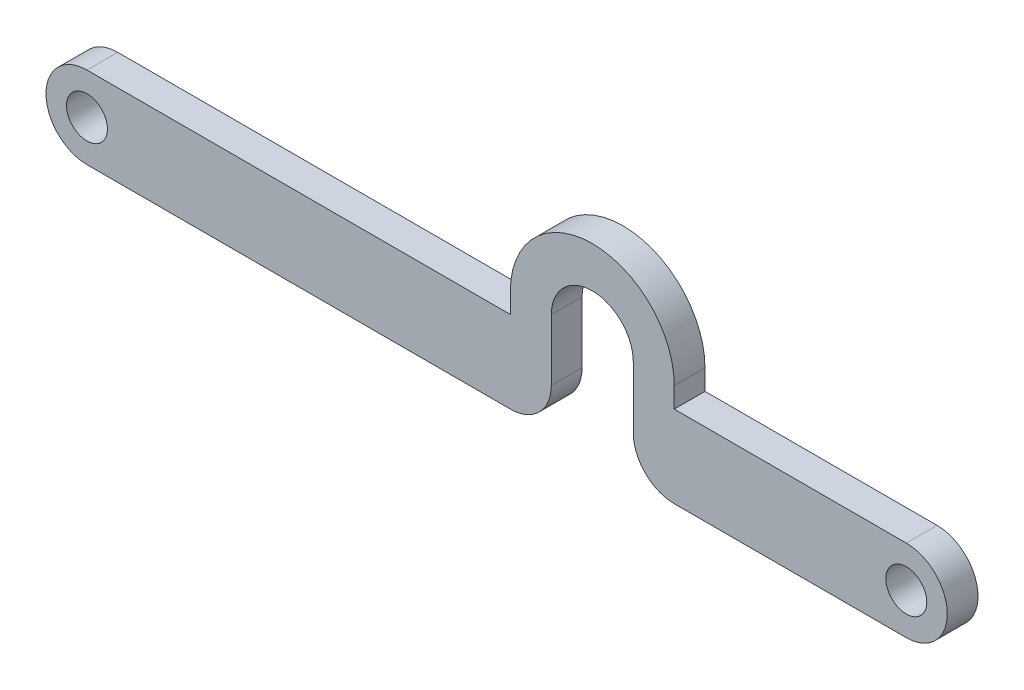
ISO-10303-21;
HEADER;
FILE_DESCRIPTION(('STEP AP214'),'2;1');
FILE_NAME('part.step','',(''),(''),'','','');
FILE_SCHEMA(('AUTOMOTIVE_DESIGN { 1 0 10303 214 1 1 1 1 }'));
ENDSEC;
DATA;
#1=APPLICATION_CONTEXT('core data for automotive mechanical design processes');
#2=APPLICATION_PROTOCOL_DEFINITION('international standard','automotive_design',2000,#1);
#3=PRODUCT_CONTEXT('',#1,'mechanical');
#4=PRODUCT('Part','Part','',(#3));
#5=PRODUCT_RELATED_PRODUCT_CATEGORY('part','',(#4));
#6=PRODUCT_DEFINITION_FORMATION('','',#4);
#7=PRODUCT_DEFINITION_CONTEXT('part definition',#1,'design');
#8=PRODUCT_DEFINITION('design','',#6,#7);
#9=PRODUCT_DEFINITION_SHAPE('','',#8);
#10=(LENGTH_UNIT() NAMED_UNIT(*) SI_UNIT(.MILLI.,.METRE.));
#11=(NAMED_UNIT(*) PLANE_ANGLE_UNIT() SI_UNIT($,.RADIAN.));
#12=(NAMED_UNIT(*) SI_UNIT($,.STERADIAN.) SOLID_ANGLE_UNIT());
#13=UNCERTAINTY_MEASURE_WITH_UNIT(LENGTH_MEASURE(1.E-05),#10,'distance_accuracy_value','');
#14=(GEOMETRIC_REPRESENTATION_CONTEXT(3) GLOBAL_UNCERTAINTY_ASSIGNED_CONTEXT((#13)) GLOBAL_UNIT_ASSIGNED_CONTEXT((#10,
#11,#12)) REPRESENTATION_CONTEXT('',''));
#15=CARTESIAN_POINT('',(0.,0.,0.));
#16=DIRECTION('',(0.,0.,1.));
#17=DIRECTION('',(1.,0.,0.));
#18=AXIS2_PLACEMENT_3D('',#15,#16,#17);
#19=CARTESIAN_POINT('',(28.6707991075856,0.,1.5));
#20=DIRECTION('',(0.,0.,-1.));
#21=DIRECTION('',(-1.,0.,0.));
#22=AXIS2_PLACEMENT_3D('',#19,#20,#21);
#23=PLANE('',#22);
#24=CARTESIAN_POINT('',(28.6707991075856,0.,1.5));
#25=DIRECTION('',(0.,0.,1.));
#26=DIRECTION('',(-1.,0.,0.));
#27=AXIS2_PLACEMENT_3D('',#24,#25,#26);
#28=CIRCLE('',#27,2.);
#29=CARTESIAN_POINT('',(26.6707991075856,0.,1.5));
#30=VERTEX_POINT('',#29);
#31=CARTESIAN_POINT('',(28.6707991075856,-2.,1.5));
#32=VERTEX_POINT('',#31);
#33=EDGE_CURVE('E197',#30,#32,#28,.T.);
#34=ORIENTED_EDGE('',*,*,#33,.T.);
#35=DIRECTION('',(1.,0.,0.));
#36=VECTOR('',#35,1.);
#37=CARTESIAN_POINT('',(28.6707991075856,-2.,1.5));
#38=LINE('',#37,#36);
#39=CARTESIAN_POINT('',(40.,-2.,1.5));
#40=VERTEX_POINT('',#39);
#41=EDGE_CURVE('E115',#32,#40,#38,.T.);
#42=ORIENTED_EDGE('',*,*,#41,.T.);
#43=CARTESIAN_POINT('',(40.,0.,1.5));
#44=DIRECTION('',(0.,0.,1.));
#45=DIRECTION('',(1.,0.,0.));
#46=AXIS2_PLACEMENT_3D('',#43,#44,#45);
#47=CIRCLE('',#46,2.);
#48=CARTESIAN_POINT('',(40.,2.,1.5));
#49=VERTEX_POINT('',#48);
#50=EDGE_CURVE('E230',#40,#49,#47,.T.);
#51=ORIENTED_EDGE('',*,*,#50,.T.);
#52=DIRECTION('',(-1.,0.,0.));
#53=VECTOR('',#52,1.);
#54=CARTESIAN_POINT('',(28.6707991075856,2.,1.5));
#55=LINE('',#54,#53);
#56=CARTESIAN_POINT('',(28.6707991075856,2.,1.5));
#57=VERTEX_POINT('',#56);
#58=EDGE_CURVE('E249',#49,#57,#55,.T.);
#59=ORIENTED_EDGE('',*,*,#58,.T.);
#60=DIRECTION('',(0.,1.,0.));
#61=VECTOR('',#60,1.);
#62=CARTESIAN_POINT('',(28.6707991075856,3.,1.5));
#63=LINE('',#62,#61);
#64=CARTESIAN_POINT('',(28.6707991075856,3.,1.5));
#65=VERTEX_POINT('',#64);
#66=EDGE_CURVE('E246',#57,#65,#63,.T.);
#67=ORIENTED_EDGE('',*,*,#66,.T.);
#68=CARTESIAN_POINT('',(24.6707991075856,3.,1.5));
#69=DIRECTION('',(0.,0.,1.));
#70=DIRECTION('',(1.,0.,0.));
#71=AXIS2_PLACEMENT_3D('',#68,#69,#70);
#72=CIRCLE('',#71,4.);
#73=CARTESIAN_POINT('',(20.6707991075856,2.99999999999997,1.5));
#74=VERTEX_POINT('',#73);
#75=EDGE_CURVE('E248',#65,#74,#72,.T.);
#76=ORIENTED_EDGE('',*,*,#75,.T.);
#77=DIRECTION('',(0.,-1.,0.));
#78=VECTOR('',#77,1.);
#79=CARTESIAN_POINT('',(20.6707991075856,2.99999999999997,1.5));
#80=LINE('',#79,#78);
#81=CARTESIAN_POINT('',(20.6707991075856,2.,1.5));
#82=VERTEX_POINT('',#81);
#83=EDGE_CURVE('E251',#74,#82,#80,.T.);
#84=ORIENTED_EDGE('',*,*,#83,.T.);
#85=DIRECTION('',(-1.,0.,0.));
#86=VECTOR('',#85,1.);
#87=CARTESIAN_POINT('',(0.,2.,1.5));
#88=LINE('',#87,#86);
#89=CARTESIAN_POINT('',(0.,2.,1.5));
#90=VERTEX_POINT('',#89);
#91=EDGE_CURVE('E257',#82,#90,#88,.T.);
#92=ORIENTED_EDGE('',*,*,#91,.T.);
#93=CARTESIAN_POINT('',(0.,0.,1.5));
#94=DIRECTION('',(0.,0.,1.));
#95=DIRECTION('',(1.,0.,0.));
#96=AXIS2_PLACEMENT_3D('',#93,#94,#95);
#97=CIRCLE('',#96,2.);
#98=CARTESIAN_POINT('',(0.,-2.,1.5));
#99=VERTEX_POINT('',#98);
#100=EDGE_CURVE('E259',#90,#99,#97,.T.);
#101=ORIENTED_EDGE('',*,*,#100,.T.);
#102=DIRECTION('',(1.,0.,0.));
#103=VECTOR('',#102,1.);
#104=CARTESIAN_POINT('',(0.,-2.,1.5));
#105=LINE('',#104,#103);
#106=CARTESIAN_POINT('',(20.6707991075856,-2.,1.5));
#107=VERTEX_POINT('',#106);
#108=EDGE_CURVE('E261',#99,#107,#105,.T.);
#109=ORIENTED_EDGE('',*,*,#108,.T.);
#110=CARTESIAN_POINT('',(20.6707991075856,0.,1.5));
#111=DIRECTION('',(0.,0.,1.));
#112=DIRECTION('',(-1.,0.,0.));
#113=AXIS2_PLACEMENT_3D('',#110,#111,#112);
#114=CIRCLE('',#113,2.);
#115=CARTESIAN_POINT('',(22.6707991075856,0.,1.5));
#116=VERTEX_POINT('',#115);
#117=EDGE_CURVE('E152',#107,#116,#114,.T.);
#118=ORIENTED_EDGE('',*,*,#117,.T.);
#119=DIRECTION('',(0.,1.,0.));
#120=VECTOR('',#119,1.);
#121=CARTESIAN_POINT('',(22.6707991075856,3.,1.5));
#122=LINE('',#121,#120);
#123=CARTESIAN_POINT('',(22.6707991075856,3.,1.5));
#124=VERTEX_POINT('',#123);
#125=EDGE_CURVE('E146',#116,#124,#122,.T.);
#126=ORIENTED_EDGE('',*,*,#125,.T.);
#127=CARTESIAN_POINT('',(24.6707991075856,3.,1.5));
#128=DIRECTION('',(0.,0.,-1.));
#129=DIRECTION('',(1.,0.,0.));
#130=AXIS2_PLACEMENT_3D('',#127,#128,#129);
#131=CIRCLE('',#130,2.);
#132=CARTESIAN_POINT('',(26.6707991075856,3.,1.5));
#133=VERTEX_POINT('',#132);
#134=EDGE_CURVE('E150',#124,#133,#131,.T.);
#135=ORIENTED_EDGE('',*,*,#134,.T.);
#136=DIRECTION('',(0.,-1.,0.));
#137=VECTOR('',#136,1.);
#138=CARTESIAN_POINT('',(26.6707991075856,0.,1.5));
#139=LINE('',#138,#137);
#140=EDGE_CURVE('E54',#133,#30,#139,.T.);
#141=ORIENTED_EDGE('',*,*,#140,.T.);
#142=EDGE_LOOP('',(#34,#42,#51,#59,#67,#76,#84,#92,#101,#109,#118,#126,#135,#141));
#143=FACE_BOUND('',#142,.T.);
#144=CARTESIAN_POINT('',(40.,0.,1.5));
#145=DIRECTION('',(0.,0.,1.));
#146=DIRECTION('',(1.,0.,0.));
#147=AXIS2_PLACEMENT_3D('',#144,#145,#146);
#148=CIRCLE('',#147,0.999999999999998);
#149=CARTESIAN_POINT('',(41.,0.,1.5));
#150=VERTEX_POINT('',#149);
#151=EDGE_CURVE('E174',#150,#150,#148,.T.);
#152=ORIENTED_EDGE('',*,*,#151,.F.);
#153=EDGE_LOOP('',(#152));
#154=FACE_BOUND('',#153,.T.);
#155=CARTESIAN_POINT('',(0.,0.,1.5));
#156=DIRECTION('',(0.,0.,1.));
#157=DIRECTION('',(1.,0.,0.));
#158=AXIS2_PLACEMENT_3D('',#155,#156,#157);
#159=CIRCLE('',#158,1.);
#160=CARTESIAN_POINT('',(1.,0.,1.5));
#161=VERTEX_POINT('',#160);
#162=EDGE_CURVE('E302',#161,#161,#159,.T.);
#163=ORIENTED_EDGE('',*,*,#162,.F.);
#164=EDGE_LOOP('',(#163));
#165=FACE_BOUND('',#164,.T.);
#166=ADVANCED_FACE('F37',(#143,#154,#165),#23,.F.);
#167=CARTESIAN_POINT('',(28.6707991075856,0.,0.));
#168=DIRECTION('',(0.,0.,-1.));
#169=DIRECTION('',(-1.,0.,0.));
#170=AXIS2_PLACEMENT_3D('',#167,#168,#169);
#171=PLANE('',#170);
#172=CARTESIAN_POINT('',(40.,0.,0.));
#173=DIRECTION('',(0.,0.,1.));
#174=DIRECTION('',(1.,0.,0.));
#175=AXIS2_PLACEMENT_3D('',#172,#173,#174);
#176=CIRCLE('',#175,0.999999999999998);
#177=CARTESIAN_POINT('',(41.,0.,0.));
#178=VERTEX_POINT('',#177);
#179=EDGE_CURVE('E307',#178,#178,#176,.T.);
#180=ORIENTED_EDGE('',*,*,#179,.T.);
#181=EDGE_LOOP('',(#180));
#182=FACE_BOUND('',#181,.T.);
#183=CARTESIAN_POINT('',(28.6707991075856,0.,0.));
#184=DIRECTION('',(0.,0.,1.));
#185=DIRECTION('',(-1.,0.,0.));
#186=AXIS2_PLACEMENT_3D('',#183,#184,#185);
#187=CIRCLE('',#186,2.);
#188=CARTESIAN_POINT('',(26.6707991075856,0.,0.));
#189=VERTEX_POINT('',#188);
#190=CARTESIAN_POINT('',(28.6707991075856,-2.,0.));
#191=VERTEX_POINT('',#190);
#192=EDGE_CURVE('E170',#189,#191,#187,.T.);
#193=ORIENTED_EDGE('',*,*,#192,.F.);
#194=DIRECTION('',(0.,-1.,0.));
#195=VECTOR('',#194,1.);
#196=CARTESIAN_POINT('',(26.6707991075856,0.,0.));
#197=LINE('',#196,#195);
#198=CARTESIAN_POINT('',(26.6707991075856,3.,0.));
#199=VERTEX_POINT('',#198);
#200=EDGE_CURVE('E107',#199,#189,#197,.T.);
#201=ORIENTED_EDGE('',*,*,#200,.F.);
#202=CARTESIAN_POINT('',(24.6707991075856,3.,0.));
#203=DIRECTION('',(0.,0.,-1.));
#204=DIRECTION('',(1.,0.,0.));
#205=AXIS2_PLACEMENT_3D('',#202,#203,#204);
#206=CIRCLE('',#205,2.);
#207=CARTESIAN_POINT('',(22.6707991075856,3.,0.));
#208=VERTEX_POINT('',#207);
#209=EDGE_CURVE('E101',#208,#199,#206,.T.);
#210=ORIENTED_EDGE('',*,*,#209,.F.);
#211=DIRECTION('',(0.,1.,0.));
#212=VECTOR('',#211,1.);
#213=CARTESIAN_POINT('',(22.6707991075856,3.,0.));
#214=LINE('',#213,#212);
#215=CARTESIAN_POINT('',(22.6707991075856,0.,0.));
#216=VERTEX_POINT('',#215);
#217=EDGE_CURVE('E160',#216,#208,#214,.T.);
#218=ORIENTED_EDGE('',*,*,#217,.F.);
#219=CARTESIAN_POINT('',(20.6707991075856,0.,0.));
#220=DIRECTION('',(0.,0.,1.));
#221=DIRECTION('',(-1.,0.,0.));
#222=AXIS2_PLACEMENT_3D('',#219,#220,#221);
#223=CIRCLE('',#222,2.);
#224=CARTESIAN_POINT('',(20.6707991075856,-2.,0.));
#225=VERTEX_POINT('',#224);
#226=EDGE_CURVE('E192',#225,#216,#223,.T.);
#227=ORIENTED_EDGE('',*,*,#226,.F.);
#228=DIRECTION('',(1.,0.,0.));
#229=VECTOR('',#228,1.);
#230=CARTESIAN_POINT('',(0.,-2.,0.));
#231=LINE('',#230,#229);
#232=CARTESIAN_POINT('',(0.,-2.,0.));
#233=VERTEX_POINT('',#232);
#234=EDGE_CURVE('E190',#233,#225,#231,.T.);
#235=ORIENTED_EDGE('',*,*,#234,.F.);
#236=CARTESIAN_POINT('',(0.,0.,0.));
#237=DIRECTION('',(0.,0.,1.));
#238=DIRECTION('',(1.,0.,0.));
#239=AXIS2_PLACEMENT_3D('',#236,#237,#238);
#240=CIRCLE('',#239,2.);
#241=CARTESIAN_POINT('',(0.,2.,0.));
#242=VERTEX_POINT('',#241);
#243=EDGE_CURVE('E188',#242,#233,#240,.T.);
#244=ORIENTED_EDGE('',*,*,#243,.F.);
#245=DIRECTION('',(-1.,0.,0.));
#246=VECTOR('',#245,1.);
#247=CARTESIAN_POINT('',(0.,2.,0.));
#248=LINE('',#247,#246);
#249=CARTESIAN_POINT('',(20.6707991075856,2.,0.));
#250=VERTEX_POINT('',#249);
#251=EDGE_CURVE('E186',#250,#242,#248,.T.);
#252=ORIENTED_EDGE('',*,*,#251,.F.);
#253=DIRECTION('',(0.,-1.,0.));
#254=VECTOR('',#253,1.);
#255=CARTESIAN_POINT('',(20.6707991075856,2.99999999999997,0.));
#256=LINE('',#255,#254);
#257=CARTESIAN_POINT('',(20.6707991075856,2.99999999999997,0.));
#258=VERTEX_POINT('',#257);
#259=EDGE_CURVE('E184',#258,#250,#256,.T.);
#260=ORIENTED_EDGE('',*,*,#259,.F.);
#261=CARTESIAN_POINT('',(24.6707991075856,3.,0.));
#262=DIRECTION('',(0.,0.,1.));
#263=DIRECTION('',(1.,0.,0.));
#264=AXIS2_PLACEMENT_3D('',#261,#262,#263);
#265=CIRCLE('',#264,4.);
#266=CARTESIAN_POINT('',(28.6707991075856,3.,0.));
#267=VERTEX_POINT('',#266);
#268=EDGE_CURVE('E182',#267,#258,#265,.T.);
#269=ORIENTED_EDGE('',*,*,#268,.F.);
#270=DIRECTION('',(0.,1.,0.));
#271=VECTOR('',#270,1.);
#272=CARTESIAN_POINT('',(28.6707991075856,3.,0.));
#273=LINE('',#272,#271);
#274=CARTESIAN_POINT('',(28.6707991075856,2.,0.));
#275=VERTEX_POINT('',#274);
#276=EDGE_CURVE('E180',#275,#267,#273,.T.);
#277=ORIENTED_EDGE('',*,*,#276,.F.);
#278=DIRECTION('',(-1.,0.,0.));
#279=VECTOR('',#278,1.);
#280=CARTESIAN_POINT('',(28.6707991075856,2.,0.));
#281=LINE('',#280,#279);
#282=CARTESIAN_POINT('',(40.,2.,0.));
#283=VERTEX_POINT('',#282);
#284=EDGE_CURVE('E178',#283,#275,#281,.T.);
#285=ORIENTED_EDGE('',*,*,#284,.F.);
#286=CARTESIAN_POINT('',(40.,0.,0.));
#287=DIRECTION('',(0.,0.,1.));
#288=DIRECTION('',(1.,0.,0.));
#289=AXIS2_PLACEMENT_3D('',#286,#287,#288);
#290=CIRCLE('',#289,2.);
#291=CARTESIAN_POINT('',(40.,-2.,0.));
#292=VERTEX_POINT('',#291);
#293=EDGE_CURVE('E176',#292,#283,#290,.T.);
#294=ORIENTED_EDGE('',*,*,#293,.F.);
#295=DIRECTION('',(1.,0.,0.));
#296=VECTOR('',#295,1.);
#297=CARTESIAN_POINT('',(28.6707991075856,-2.,0.));
#298=LINE('',#297,#296);
#299=EDGE_CURVE('E173',#191,#292,#298,.T.);
#300=ORIENTED_EDGE('',*,*,#299,.F.);
#301=EDGE_LOOP('',(#193,#201,#210,#218,#227,#235,#244,#252,#260,#269,#277,#285,#294,#300));
#302=FACE_BOUND('',#301,.T.);
#303=CARTESIAN_POINT('',(0.,0.,0.));
#304=DIRECTION('',(0.,0.,1.));
#305=DIRECTION('',(1.,0.,0.));
#306=AXIS2_PLACEMENT_3D('',#303,#304,#305);
#307=CIRCLE('',#306,1.);
#308=CARTESIAN_POINT('',(1.,0.,0.));
#309=VERTEX_POINT('',#308);
#310=EDGE_CURVE('E305',#309,#309,#307,.T.);
#311=ORIENTED_EDGE('',*,*,#310,.T.);
#312=EDGE_LOOP('',(#311));
#313=FACE_BOUND('',#312,.T.);
#314=ADVANCED_FACE('F234',(#182,#302,#313),#171,.T.);
#315=CARTESIAN_POINT('',(28.6707991075856,0.,1.5));
#316=DIRECTION('',(0.,0.,-1.));
#317=DIRECTION('',(-1.,0.,0.));
#318=AXIS2_PLACEMENT_3D('',#315,#316,#317);
#319=CYLINDRICAL_SURFACE('',#318,2.);
#320=ORIENTED_EDGE('',*,*,#192,.T.);
#321=DIRECTION('',(0.,0.,-1.));
#322=VECTOR('',#321,1.);
#323=CARTESIAN_POINT('',(28.6707991075856,-2.,1.5));
#324=LINE('',#323,#322);
#325=EDGE_CURVE('E11',#32,#191,#324,.T.);
#326=ORIENTED_EDGE('',*,*,#325,.F.);
#327=ORIENTED_EDGE('',*,*,#33,.F.);
#328=DIRECTION('',(0.,0.,-1.));
#329=VECTOR('',#328,1.);
#330=CARTESIAN_POINT('',(26.6707991075856,0.,1.5));
#331=LINE('',#330,#329);
#332=EDGE_CURVE('E166',#30,#189,#331,.T.);
#333=ORIENTED_EDGE('',*,*,#332,.T.);
#334=EDGE_LOOP('',(#320,#326,#327,#333));
#335=FACE_BOUND('',#334,.T.);
#336=ADVANCED_FACE('F39',(#335),#319,.T.);
#337=CARTESIAN_POINT('',(28.6707991075856,-2.,1.5));
#338=DIRECTION('',(0.,1.,0.));
#339=DIRECTION('',(0.,0.,1.));
#340=AXIS2_PLACEMENT_3D('',#337,#338,#339);
#341=PLANE('',#340);
#342=ORIENTED_EDGE('',*,*,#299,.T.);
#343=DIRECTION('',(0.,0.,-1.));
#344=VECTOR('',#343,1.);
#345=CARTESIAN_POINT('',(40.,-2.,1.5));
#346=LINE('',#345,#344);
#347=EDGE_CURVE('E46',#40,#292,#346,.T.);
#348=ORIENTED_EDGE('',*,*,#347,.F.);
#349=ORIENTED_EDGE('',*,*,#41,.F.);
#350=ORIENTED_EDGE('',*,*,#325,.T.);
#351=EDGE_LOOP('',(#342,#348,#349,#350));
#352=FACE_BOUND('',#351,.T.);
#353=ADVANCED_FACE('F422',(#352),#341,.F.);
#354=CARTESIAN_POINT('',(40.,0.,1.5));
#355=DIRECTION('',(0.,0.,-1.));
#356=DIRECTION('',(-1.,0.,0.));
#357=AXIS2_PLACEMENT_3D('',#354,#355,#356);
#358=CYLINDRICAL_SURFACE('',#357,2.);
#359=ORIENTED_EDGE('',*,*,#293,.T.);
#360=DIRECTION('',(0.,0.,-1.));
#361=VECTOR('',#360,1.);
#362=CARTESIAN_POINT('',(40.,2.,1.5));
#363=LINE('',#362,#361);
#364=EDGE_CURVE('E222',#49,#283,#363,.T.);
#365=ORIENTED_EDGE('',*,*,#364,.F.);
#366=ORIENTED_EDGE('',*,*,#50,.F.);
#367=ORIENTED_EDGE('',*,*,#347,.T.);
#368=EDGE_LOOP('',(#359,#365,#366,#367));
#369=FACE_BOUND('',#368,.T.);
#370=ADVANCED_FACE('F228',(#369),#358,.T.);
#371=CARTESIAN_POINT('',(28.6707991075856,2.,1.5));
#372=DIRECTION('',(0.,-1.,0.));
#373=DIRECTION('',(0.,0.,-1.));
#374=AXIS2_PLACEMENT_3D('',#371,#372,#373);
#375=PLANE('',#374);
#376=ORIENTED_EDGE('',*,*,#284,.T.);
#377=DIRECTION('',(0.,0.,-1.));
#378=VECTOR('',#377,1.);
#379=CARTESIAN_POINT('',(28.6707991075856,2.,1.5));
#380=LINE('',#379,#378);
#381=EDGE_CURVE('E219',#57,#275,#380,.T.);
#382=ORIENTED_EDGE('',*,*,#381,.F.);
#383=ORIENTED_EDGE('',*,*,#58,.F.);
#384=ORIENTED_EDGE('',*,*,#364,.T.);
#385=EDGE_LOOP('',(#376,#382,#383,#384));
#386=FACE_BOUND('',#385,.T.);
#387=ADVANCED_FACE('F240',(#386),#375,.F.);
#388=CARTESIAN_POINT('',(28.6707991075856,3.,1.5));
#389=DIRECTION('',(-1.,0.,0.));
#390=DIRECTION('',(0.,0.,1.));
#391=AXIS2_PLACEMENT_3D('',#388,#389,#390);
#392=PLANE('',#391);
#393=ORIENTED_EDGE('',*,*,#276,.T.);
#394=DIRECTION('',(0.,0.,-1.));
#395=VECTOR('',#394,1.);
#396=CARTESIAN_POINT('',(28.6707991075856,3.,1.5));
#397=LINE('',#396,#395);
#398=EDGE_CURVE('E216',#65,#267,#397,.T.);
#399=ORIENTED_EDGE('',*,*,#398,.F.);
#400=ORIENTED_EDGE('',*,*,#66,.F.);
#401=ORIENTED_EDGE('',*,*,#381,.T.);
#402=EDGE_LOOP('',(#393,#399,#400,#401));
#403=FACE_BOUND('',#402,.T.);
#404=ADVANCED_FACE('F244',(#403),#392,.F.);
#405=CARTESIAN_POINT('',(24.6707991075856,3.,1.5));
#406=DIRECTION('',(0.,0.,-1.));
#407=DIRECTION('',(-1.,0.,0.));
#408=AXIS2_PLACEMENT_3D('',#405,#406,#407);
#409=CYLINDRICAL_SURFACE('',#408,4.);
#410=ORIENTED_EDGE('',*,*,#268,.T.);
#411=DIRECTION('',(0.,0.,-1.));
#412=VECTOR('',#411,1.);
#413=CARTESIAN_POINT('',(20.6707991075856,2.99999999999997,1.5));
#414=LINE('',#413,#412);
#415=EDGE_CURVE('E213',#74,#258,#414,.T.);
#416=ORIENTED_EDGE('',*,*,#415,.F.);
#417=ORIENTED_EDGE('',*,*,#75,.F.);
#418=ORIENTED_EDGE('',*,*,#398,.T.);
#419=EDGE_LOOP('',(#410,#416,#417,#418));
#420=FACE_BOUND('',#419,.T.);
#421=ADVANCED_FACE('F387',(#420),#409,.T.);
#422=CARTESIAN_POINT('',(20.6707991075856,2.99999999999997,1.5));
#423=DIRECTION('',(1.,0.,0.));
#424=DIRECTION('',(0.,0.,-1.));
#425=AXIS2_PLACEMENT_3D('',#422,#423,#424);
#426=PLANE('',#425);
#427=ORIENTED_EDGE('',*,*,#259,.T.);
#428=DIRECTION('',(0.,0.,-1.));
#429=VECTOR('',#428,1.);
#430=CARTESIAN_POINT('',(20.6707991075856,2.,1.5));
#431=LINE('',#430,#429);
#432=EDGE_CURVE('E210',#82,#250,#431,.T.);
#433=ORIENTED_EDGE('',*,*,#432,.F.);
#434=ORIENTED_EDGE('',*,*,#83,.F.);
#435=ORIENTED_EDGE('',*,*,#415,.T.);
#436=EDGE_LOOP('',(#427,#433,#434,#435));
#437=FACE_BOUND('',#436,.T.);
#438=ADVANCED_FACE('F377',(#437),#426,.F.);
#439=CARTESIAN_POINT('',(0.,2.,1.5));
#440=DIRECTION('',(0.,-1.,0.));
#441=DIRECTION('',(0.,0.,-1.));
#442=AXIS2_PLACEMENT_3D('',#439,#440,#441);
#443=PLANE('',#442);
#444=ORIENTED_EDGE('',*,*,#251,.T.);
#445=DIRECTION('',(0.,0.,-1.));
#446=VECTOR('',#445,1.);
#447=CARTESIAN_POINT('',(0.,2.,1.5));
#448=LINE('',#447,#446);
#449=EDGE_CURVE('E207',#90,#242,#448,.T.);
#450=ORIENTED_EDGE('',*,*,#449,.F.);
#451=ORIENTED_EDGE('',*,*,#91,.F.);
#452=ORIENTED_EDGE('',*,*,#432,.T.);
#453=EDGE_LOOP('',(#444,#450,#451,#452));
#454=FACE_BOUND('',#453,.T.);
#455=ADVANCED_FACE('F367',(#454),#443,.F.);
#456=CARTESIAN_POINT('',(0.,0.,1.5));
#457=DIRECTION('',(0.,0.,-1.));
#458=DIRECTION('',(-1.,0.,0.));
#459=AXIS2_PLACEMENT_3D('',#456,#457,#458);
#460=CYLINDRICAL_SURFACE('',#459,2.);
#461=ORIENTED_EDGE('',*,*,#243,.T.);
#462=DIRECTION('',(0.,0.,-1.));
#463=VECTOR('',#462,1.);
#464=CARTESIAN_POINT('',(0.,-2.,1.5));
#465=LINE('',#464,#463);
#466=EDGE_CURVE('E204',#99,#233,#465,.T.);
#467=ORIENTED_EDGE('',*,*,#466,.F.);
#468=ORIENTED_EDGE('',*,*,#100,.F.);
#469=ORIENTED_EDGE('',*,*,#449,.T.);
#470=EDGE_LOOP('',(#461,#467,#468,#469));
#471=FACE_BOUND('',#470,.T.);
#472=ADVANCED_FACE('F358',(#471),#460,.T.);
#473=CARTESIAN_POINT('',(0.,-2.,1.5));
#474=DIRECTION('',(0.,1.,0.));
#475=DIRECTION('',(0.,0.,1.));
#476=AXIS2_PLACEMENT_3D('',#473,#474,#475);
#477=PLANE('',#476);
#478=ORIENTED_EDGE('',*,*,#234,.T.);
#479=DIRECTION('',(0.,0.,-1.));
#480=VECTOR('',#479,1.);
#481=CARTESIAN_POINT('',(20.6707991075856,-2.,1.5));
#482=LINE('',#481,#480);
#483=EDGE_CURVE('E201',#107,#225,#482,.T.);
#484=ORIENTED_EDGE('',*,*,#483,.F.);
#485=ORIENTED_EDGE('',*,*,#108,.F.);
#486=ORIENTED_EDGE('',*,*,#466,.T.);
#487=EDGE_LOOP('',(#478,#484,#485,#486));
#488=FACE_BOUND('',#487,.T.);
#489=ADVANCED_FACE('F267',(#488),#477,.F.);
#490=CARTESIAN_POINT('',(20.6707991075856,0.,1.5));
#491=DIRECTION('',(0.,0.,-1.));
#492=DIRECTION('',(-1.,0.,0.));
#493=AXIS2_PLACEMENT_3D('',#490,#491,#492);
#494=CYLINDRICAL_SURFACE('',#493,2.);
#495=ORIENTED_EDGE('',*,*,#226,.T.);
#496=DIRECTION('',(0.,0.,-1.));
#497=VECTOR('',#496,1.);
#498=CARTESIAN_POINT('',(22.6707991075856,0.,1.5));
#499=LINE('',#498,#497);
#500=EDGE_CURVE('E161',#116,#216,#499,.T.);
#501=ORIENTED_EDGE('',*,*,#500,.F.);
#502=ORIENTED_EDGE('',*,*,#117,.F.);
#503=ORIENTED_EDGE('',*,*,#483,.T.);
#504=EDGE_LOOP('',(#495,#501,#502,#503));
#505=FACE_BOUND('',#504,.T.);
#506=ADVANCED_FACE('F271',(#505),#494,.T.);
#507=CARTESIAN_POINT('',(22.6707991075856,3.,1.5));
#508=DIRECTION('',(-1.,0.,0.));
#509=DIRECTION('',(0.,0.,1.));
#510=AXIS2_PLACEMENT_3D('',#507,#508,#509);
#511=PLANE('',#510);
#512=ORIENTED_EDGE('',*,*,#217,.T.);
#513=DIRECTION('',(0.,0.,-1.));
#514=VECTOR('',#513,1.);
#515=CARTESIAN_POINT('',(22.6707991075856,3.,1.5));
#516=LINE('',#515,#514);
#517=EDGE_CURVE('E157',#124,#208,#516,.T.);
#518=ORIENTED_EDGE('',*,*,#517,.F.);
#519=ORIENTED_EDGE('',*,*,#125,.F.);
#520=ORIENTED_EDGE('',*,*,#500,.T.);
#521=EDGE_LOOP('',(#512,#518,#519,#520));
#522=FACE_BOUND('',#521,.T.);
#523=ADVANCED_FACE('F158',(#522),#511,.F.);
#524=CARTESIAN_POINT('',(24.6707991075856,3.,1.5));
#525=DIRECTION('',(0.,0.,-1.));
#526=DIRECTION('',(-1.,0.,0.));
#527=AXIS2_PLACEMENT_3D('',#524,#525,#526);
#528=CYLINDRICAL_SURFACE('',#527,2.);
#529=ORIENTED_EDGE('',*,*,#209,.T.);
#530=DIRECTION('',(0.,0.,-1.));
#531=VECTOR('',#530,1.);
#532=CARTESIAN_POINT('',(26.6707991075856,3.,1.5));
#533=LINE('',#532,#531);
#534=EDGE_CURVE('E162',#133,#199,#533,.T.);
#535=ORIENTED_EDGE('',*,*,#534,.F.);
#536=ORIENTED_EDGE('',*,*,#134,.F.);
#537=ORIENTED_EDGE('',*,*,#517,.T.);
#538=EDGE_LOOP('',(#529,#535,#536,#537));
#539=FACE_BOUND('',#538,.T.);
#540=ADVANCED_FACE('F164',(#539),#528,.F.);
#541=CARTESIAN_POINT('',(26.6707991075856,0.,1.5));
#542=DIRECTION('',(1.,0.,0.));
#543=DIRECTION('',(0.,0.,-1.));
#544=AXIS2_PLACEMENT_3D('',#541,#542,#543);
#545=PLANE('',#544);
#546=ORIENTED_EDGE('',*,*,#200,.T.);
#547=ORIENTED_EDGE('',*,*,#332,.F.);
#548=ORIENTED_EDGE('',*,*,#140,.F.);
#549=ORIENTED_EDGE('',*,*,#534,.T.);
#550=EDGE_LOOP('',(#546,#547,#548,#549));
#551=FACE_BOUND('',#550,.T.);
#552=ADVANCED_FACE('F275',(#551),#545,.F.);
#553=CARTESIAN_POINT('',(40.,0.,1.5));
#554=DIRECTION('',(0.,0.,-1.));
#555=DIRECTION('',(-1.,0.,0.));
#556=AXIS2_PLACEMENT_3D('',#553,#554,#555);
#557=CYLINDRICAL_SURFACE('',#556,0.999999999999998);
#558=ORIENTED_EDGE('',*,*,#151,.T.);
#559=EDGE_LOOP('',(#558));
#560=FACE_BOUND('',#559,.T.);
#561=ORIENTED_EDGE('',*,*,#179,.F.);
#562=EDGE_LOOP('',(#561));
#563=FACE_BOUND('',#562,.T.);
#564=ADVANCED_FACE('F277',(#560,#563),#557,.F.);
#565=CARTESIAN_POINT('',(0.,0.,1.5));
#566=DIRECTION('',(0.,0.,-1.));
#567=DIRECTION('',(-1.,0.,0.));
#568=AXIS2_PLACEMENT_3D('',#565,#566,#567);
#569=CYLINDRICAL_SURFACE('',#568,1.);
#570=ORIENTED_EDGE('',*,*,#162,.T.);
#571=EDGE_LOOP('',(#570));
#572=FACE_BOUND('',#571,.T.);
#573=ORIENTED_EDGE('',*,*,#310,.F.);
#574=EDGE_LOOP('',(#573));
#575=FACE_BOUND('',#574,.T.);
#576=ADVANCED_FACE('F283',(#572,#575),#569,.F.);
#577=CLOSED_SHELL('',(#166,#314,#336,#353,#370,#387,#404,#421,#438,#455,#472,#489,#506,#523,
#540,#552,#564,#576));
#578=MANIFOLD_SOLID_BREP('B2',#577);
#579=ADVANCED_BREP_SHAPE_REPRESENTATION('',(#18,#578),#14);
#580=SHAPE_DEFINITION_REPRESENTATION(#9,#579);
ENDSEC;
END-ISO-10303-21;
